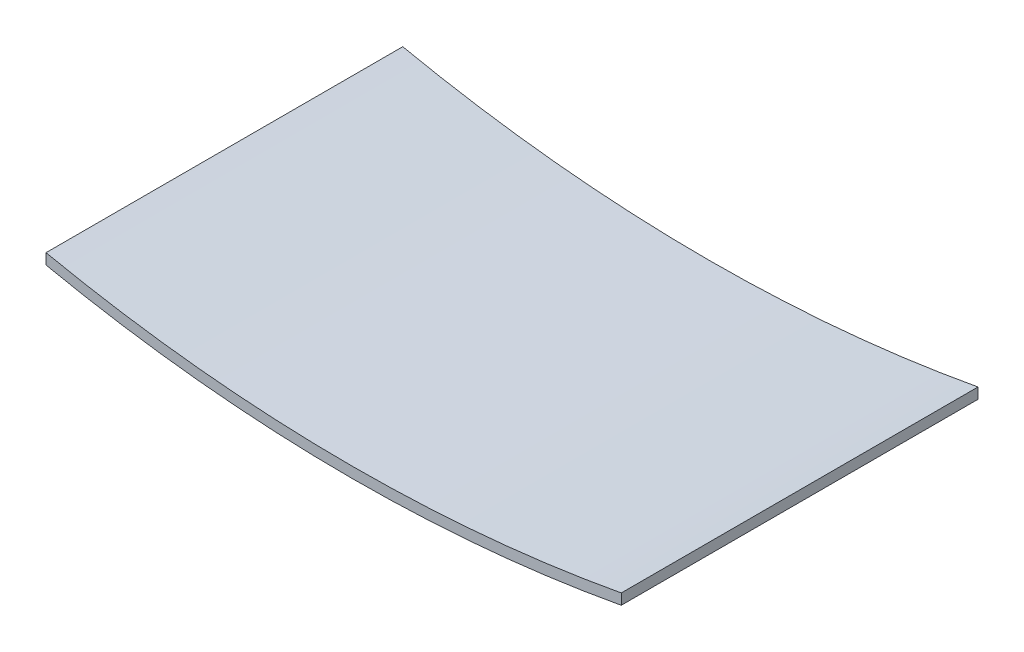
ISO-10303-21;
HEADER;
FILE_DESCRIPTION(('STEP AP214'),'2;1');
FILE_NAME('part.step','',(''),(''),'','','');
FILE_SCHEMA(('AUTOMOTIVE_DESIGN { 1 0 10303 214 1 1 1 1 }'));
ENDSEC;
DATA;
#1=APPLICATION_CONTEXT('core data for automotive mechanical design processes');
#2=APPLICATION_PROTOCOL_DEFINITION('international standard','automotive_design',2000,#1);
#3=PRODUCT_CONTEXT('',#1,'mechanical');
#4=PRODUCT('Part','Part','',(#3));
#5=PRODUCT_RELATED_PRODUCT_CATEGORY('part','',(#4));
#6=PRODUCT_DEFINITION_FORMATION('','',#4);
#7=PRODUCT_DEFINITION_CONTEXT('part definition',#1,'design');
#8=PRODUCT_DEFINITION('design','',#6,#7);
#9=PRODUCT_DEFINITION_SHAPE('','',#8);
#10=(LENGTH_UNIT() NAMED_UNIT(*) SI_UNIT(.MILLI.,.METRE.));
#11=(NAMED_UNIT(*) PLANE_ANGLE_UNIT() SI_UNIT($,.RADIAN.));
#12=(NAMED_UNIT(*) SI_UNIT($,.STERADIAN.) SOLID_ANGLE_UNIT());
#13=UNCERTAINTY_MEASURE_WITH_UNIT(LENGTH_MEASURE(1.E-05),#10,'distance_accuracy_value','');
#14=(GEOMETRIC_REPRESENTATION_CONTEXT(3) GLOBAL_UNCERTAINTY_ASSIGNED_CONTEXT((#13)) GLOBAL_UNIT_ASSIGNED_CONTEXT((#10,
#11,#12)) REPRESENTATION_CONTEXT('',''));
#15=CARTESIAN_POINT('',(0.,0.,0.));
#16=DIRECTION('',(0.,0.,1.));
#17=DIRECTION('',(1.,0.,0.));
#18=AXIS2_PLACEMENT_3D('',#15,#16,#17);
#19=CARTESIAN_POINT('',(0.,0.,266.7));
#20=DIRECTION('',(1.,0.,0.));
#21=DIRECTION('',(0.,1.,0.));
#22=AXIS2_PLACEMENT_3D('',#19,#20,#21);
#23=PLANE('',#22);
#24=DIRECTION('',(0.,0.,-1.));
#25=VECTOR('',#24,1.);
#26=CARTESIAN_POINT('',(0.,-1.27000000000022,304.8));
#27=LINE('',#26,#25);
#28=CARTESIAN_POINT('',(0.,-1.27000000000022,266.7));
#29=VERTEX_POINT('',#28);
#30=CARTESIAN_POINT('',(0.,-1.27000000000022,139.7));
#31=VERTEX_POINT('',#30);
#32=EDGE_CURVE('E84',#29,#31,#27,.T.);
#33=ORIENTED_EDGE('',*,*,#32,.T.);
#34=DIRECTION('',(0.,1.,0.));
#35=VECTOR('',#34,1.);
#36=CARTESIAN_POINT('',(0.,-60.706,139.7));
#37=LINE('',#36,#35);
#38=CARTESIAN_POINT('',(0.,-5.07999999999988,139.7));
#39=VERTEX_POINT('',#38);
#40=EDGE_CURVE('E47',#39,#31,#37,.T.);
#41=ORIENTED_EDGE('',*,*,#40,.F.);
#42=DIRECTION('',(0.,0.,-1.));
#43=VECTOR('',#42,1.);
#44=CARTESIAN_POINT('',(1.11022302462516E-13,-5.07999999999997,266.7));
#45=LINE('',#44,#43);
#46=CARTESIAN_POINT('',(1.11022302462516E-13,-5.07999999999997,266.7));
#47=VERTEX_POINT('',#46);
#48=EDGE_CURVE('E40',#47,#39,#45,.T.);
#49=ORIENTED_EDGE('',*,*,#48,.F.);
#50=DIRECTION('',(0.,-1.,0.));
#51=VECTOR('',#50,1.);
#52=CARTESIAN_POINT('',(0.,0.,266.7));
#53=LINE('',#52,#51);
#54=EDGE_CURVE('E93',#29,#47,#53,.T.);
#55=ORIENTED_EDGE('',*,*,#54,.F.);
#56=EDGE_LOOP('',(#33,#41,#49,#55));
#57=FACE_BOUND('',#56,.T.);
#58=ADVANCED_FACE('F33',(#57),#23,.F.);
#59=CARTESIAN_POINT('',(108.743750000001,511.466224482316,266.7));
#60=DIRECTION('',(0.,0.,-1.));
#61=DIRECTION('',(-1.,0.,0.));
#62=AXIS2_PLACEMENT_3D('',#59,#60,#61);
#63=CYLINDRICAL_SURFACE('',#62,527.868549158782);
#64=ORIENTED_EDGE('',*,*,#48,.T.);
#65=CARTESIAN_POINT('',(108.743750000001,511.466224482316,139.7));
#66=DIRECTION('',(0.,0.,1.));
#67=DIRECTION('',(1.,0.,0.));
#68=AXIS2_PLACEMENT_3D('',#65,#66,#67);
#69=CIRCLE('',#68,527.868549158782);
#70=CARTESIAN_POINT('',(204.7875,-7.59138626714151,139.7));
#71=VERTEX_POINT('',#70);
#72=EDGE_CURVE('E71',#39,#71,#69,.T.);
#73=ORIENTED_EDGE('',*,*,#72,.T.);
#74=DIRECTION('',(0.,0.,-1.));
#75=VECTOR('',#74,1.);
#76=CARTESIAN_POINT('',(204.7875,-7.59138626714149,266.7));
#77=LINE('',#76,#75);
#78=CARTESIAN_POINT('',(204.7875,-7.59138626714149,266.7));
#79=VERTEX_POINT('',#78);
#80=EDGE_CURVE('E87',#79,#71,#77,.T.);
#81=ORIENTED_EDGE('',*,*,#80,.F.);
#82=CARTESIAN_POINT('',(108.743750000001,511.466224482316,266.7));
#83=DIRECTION('',(0.,0.,1.));
#84=DIRECTION('',(-1.,0.,0.));
#85=AXIS2_PLACEMENT_3D('',#82,#83,#84);
#86=CIRCLE('',#85,527.868549158782);
#87=EDGE_CURVE('E54',#47,#79,#86,.T.);
#88=ORIENTED_EDGE('',*,*,#87,.F.);
#89=EDGE_LOOP('',(#64,#73,#81,#88));
#90=FACE_BOUND('',#89,.T.);
#91=ADVANCED_FACE('F86',(#90),#63,.T.);
#92=CARTESIAN_POINT('',(204.7875,-2.51138626714152,266.7));
#93=DIRECTION('',(-1.,0.,0.));
#94=DIRECTION('',(0.,-1.,0.));
#95=AXIS2_PLACEMENT_3D('',#92,#93,#94);
#96=PLANE('',#95);
#97=ORIENTED_EDGE('',*,*,#80,.T.);
#98=DIRECTION('',(0.,1.,0.));
#99=VECTOR('',#98,1.);
#100=CARTESIAN_POINT('',(204.7875,-60.706,139.7));
#101=LINE('',#100,#99);
#102=CARTESIAN_POINT('',(204.7875,-3.78138626714153,139.7));
#103=VERTEX_POINT('',#102);
#104=EDGE_CURVE('E74',#71,#103,#101,.T.);
#105=ORIENTED_EDGE('',*,*,#104,.T.);
#106=DIRECTION('',(0.,0.,-1.));
#107=VECTOR('',#106,1.);
#108=CARTESIAN_POINT('',(204.7875,-3.78138626714164,304.8));
#109=LINE('',#108,#107);
#110=CARTESIAN_POINT('',(204.7875,-3.78138626714164,266.7));
#111=VERTEX_POINT('',#110);
#112=EDGE_CURVE('E78',#111,#103,#109,.T.);
#113=ORIENTED_EDGE('',*,*,#112,.F.);
#114=DIRECTION('',(0.,1.,0.));
#115=VECTOR('',#114,1.);
#116=CARTESIAN_POINT('',(204.7875,-2.51138626714152,266.7));
#117=LINE('',#116,#115);
#118=EDGE_CURVE('E88',#79,#111,#117,.T.);
#119=ORIENTED_EDGE('',*,*,#118,.F.);
#120=EDGE_LOOP('',(#97,#105,#113,#119));
#121=FACE_BOUND('',#120,.T.);
#122=ADVANCED_FACE('F103',(#121),#96,.F.);
#123=CARTESIAN_POINT('',(108.74375,516.546224482316,266.7));
#124=DIRECTION('',(0.,0.,-1.));
#125=DIRECTION('',(-1.,0.,0.));
#126=AXIS2_PLACEMENT_3D('',#123,#124,#125);
#127=PLANE('',#126);
#128=ORIENTED_EDGE('',*,*,#118,.T.);
#129=CARTESIAN_POINT('',(108.743750000001,515.276224482351,266.7));
#130=DIRECTION('',(0.,0.,-1.));
#131=DIRECTION('',(-1.,0.,0.));
#132=AXIS2_PLACEMENT_3D('',#129,#130,#131);
#133=CIRCLE('',#132,527.868549158816);
#134=EDGE_CURVE('E95',#111,#29,#133,.T.);
#135=ORIENTED_EDGE('',*,*,#134,.T.);
#136=ORIENTED_EDGE('',*,*,#54,.T.);
#137=ORIENTED_EDGE('',*,*,#87,.T.);
#138=EDGE_LOOP('',(#128,#135,#136,#137));
#139=FACE_BOUND('',#138,.T.);
#140=ADVANCED_FACE('F107',(#139),#127,.F.);
#141=CARTESIAN_POINT('',(108.743750000001,515.276224482351,304.8));
#142=DIRECTION('',(0.,0.,-1.));
#143=DIRECTION('',(-1.,0.,0.));
#144=AXIS2_PLACEMENT_3D('',#141,#142,#143);
#145=CYLINDRICAL_SURFACE('',#144,527.868549158816);
#146=ORIENTED_EDGE('',*,*,#112,.T.);
#147=CARTESIAN_POINT('',(108.743750000001,515.276224482351,139.7));
#148=DIRECTION('',(0.,0.,1.));
#149=DIRECTION('',(1.,0.,0.));
#150=AXIS2_PLACEMENT_3D('',#147,#148,#149);
#151=CIRCLE('',#150,527.868549158816);
#152=EDGE_CURVE('E11',#103,#31,#151,.F.);
#153=ORIENTED_EDGE('',*,*,#152,.T.);
#154=ORIENTED_EDGE('',*,*,#32,.F.);
#155=ORIENTED_EDGE('',*,*,#134,.F.);
#156=EDGE_LOOP('',(#146,#153,#154,#155));
#157=FACE_BOUND('',#156,.T.);
#158=ADVANCED_FACE('F106',(#157),#145,.F.);
#159=CARTESIAN_POINT('',(0.,-60.706,139.7));
#160=DIRECTION('',(0.,0.,1.));
#161=DIRECTION('',(1.,0.,0.));
#162=AXIS2_PLACEMENT_3D('',#159,#160,#161);
#163=PLANE('',#162);
#164=ORIENTED_EDGE('',*,*,#40,.T.);
#165=ORIENTED_EDGE('',*,*,#152,.F.);
#166=ORIENTED_EDGE('',*,*,#104,.F.);
#167=ORIENTED_EDGE('',*,*,#72,.F.);
#168=EDGE_LOOP('',(#164,#165,#166,#167));
#169=FACE_BOUND('',#168,.T.);
#170=ADVANCED_FACE('F72',(#169),#163,.F.);
#171=CLOSED_SHELL('',(#58,#91,#122,#140,#158,#170));
#172=MANIFOLD_SOLID_BREP('B2',#171);
#173=ADVANCED_BREP_SHAPE_REPRESENTATION('',(#18,#172),#14);
#174=SHAPE_DEFINITION_REPRESENTATION(#9,#173);
ENDSEC;
END-ISO-10303-21;
